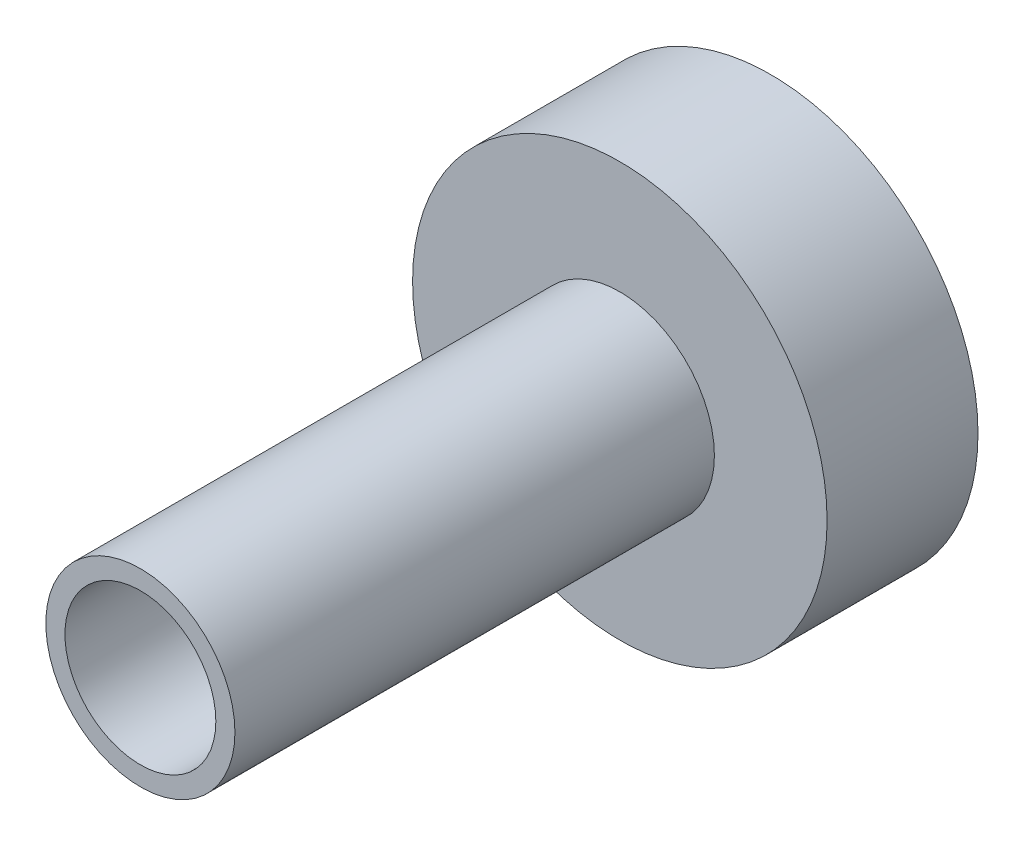
ISO-10303-21;
HEADER;
FILE_DESCRIPTION(('STEP AP214'),'2;1');
FILE_NAME('part.step','',(''),(''),'','','');
FILE_SCHEMA(('AUTOMOTIVE_DESIGN { 1 0 10303 214 1 1 1 1 }'));
ENDSEC;
DATA;
#1=APPLICATION_CONTEXT('core data for automotive mechanical design processes');
#2=APPLICATION_PROTOCOL_DEFINITION('international standard','automotive_design',2000,#1);
#3=PRODUCT_CONTEXT('',#1,'mechanical');
#4=PRODUCT('Part','Part','',(#3));
#5=PRODUCT_RELATED_PRODUCT_CATEGORY('part','',(#4));
#6=PRODUCT_DEFINITION_FORMATION('','',#4);
#7=PRODUCT_DEFINITION_CONTEXT('part definition',#1,'design');
#8=PRODUCT_DEFINITION('design','',#6,#7);
#9=PRODUCT_DEFINITION_SHAPE('','',#8);
#10=(LENGTH_UNIT() NAMED_UNIT(*) SI_UNIT(.MILLI.,.METRE.));
#11=(NAMED_UNIT(*) PLANE_ANGLE_UNIT() SI_UNIT($,.RADIAN.));
#12=(NAMED_UNIT(*) SI_UNIT($,.STERADIAN.) SOLID_ANGLE_UNIT());
#13=UNCERTAINTY_MEASURE_WITH_UNIT(LENGTH_MEASURE(1.E-05),#10,'distance_accuracy_value','');
#14=(GEOMETRIC_REPRESENTATION_CONTEXT(3) GLOBAL_UNCERTAINTY_ASSIGNED_CONTEXT((#13)) GLOBAL_UNIT_ASSIGNED_CONTEXT((#10,
#11,#12)) REPRESENTATION_CONTEXT('',''));
#15=CARTESIAN_POINT('',(0.,0.,0.));
#16=DIRECTION('',(0.,0.,1.));
#17=DIRECTION('',(1.,0.,0.));
#18=AXIS2_PLACEMENT_3D('',#15,#16,#17);
#19=CARTESIAN_POINT('',(0.,0.,33.));
#20=DIRECTION('',(0.,0.,1.));
#21=DIRECTION('',(1.,0.,0.));
#22=AXIS2_PLACEMENT_3D('',#19,#20,#21);
#23=PLANE('',#22);
#24=CARTESIAN_POINT('',(0.,0.,33.));
#25=DIRECTION('',(0.,0.,1.));
#26=DIRECTION('',(1.,0.,0.));
#27=AXIS2_PLACEMENT_3D('',#24,#25,#26);
#28=CIRCLE('',#27,3.95);
#29=CARTESIAN_POINT('',(3.95,0.,33.));
#30=VERTEX_POINT('',#29);
#31=EDGE_CURVE('E38',#30,#30,#28,.T.);
#32=ORIENTED_EDGE('',*,*,#31,.F.);
#33=EDGE_LOOP('',(#32));
#34=FACE_BOUND('',#33,.T.);
#35=CARTESIAN_POINT('',(0.,0.,33.));
#36=DIRECTION('',(0.,0.,1.));
#37=DIRECTION('',(1.,0.,0.));
#38=AXIS2_PLACEMENT_3D('',#35,#36,#37);
#39=CIRCLE('',#38,4.95);
#40=CARTESIAN_POINT('',(4.95,0.,33.));
#41=VERTEX_POINT('',#40);
#42=EDGE_CURVE('E52',#41,#41,#39,.T.);
#43=ORIENTED_EDGE('',*,*,#42,.T.);
#44=EDGE_LOOP('',(#43));
#45=FACE_BOUND('',#44,.T.);
#46=ADVANCED_FACE('F31',(#34,#45),#23,.T.);
#47=CARTESIAN_POINT('',(0.,0.,33.));
#48=DIRECTION('',(0.,0.,-1.));
#49=DIRECTION('',(-1.,0.,0.));
#50=AXIS2_PLACEMENT_3D('',#47,#48,#49);
#51=CYLINDRICAL_SURFACE('',#50,10.85);
#52=CARTESIAN_POINT('',(0.,0.,0.));
#53=DIRECTION('',(0.,0.,1.));
#54=DIRECTION('',(1.,0.,0.));
#55=AXIS2_PLACEMENT_3D('',#52,#53,#54);
#56=CIRCLE('',#55,10.85);
#57=CARTESIAN_POINT('',(10.85,0.,0.));
#58=VERTEX_POINT('',#57);
#59=EDGE_CURVE('E10',#58,#58,#56,.T.);
#60=ORIENTED_EDGE('',*,*,#59,.T.);
#61=EDGE_LOOP('',(#60));
#62=FACE_BOUND('',#61,.T.);
#63=CARTESIAN_POINT('',(0.,0.,7.9));
#64=DIRECTION('',(0.,0.,1.));
#65=DIRECTION('',(1.,0.,0.));
#66=AXIS2_PLACEMENT_3D('',#63,#64,#65);
#67=CIRCLE('',#66,10.85);
#68=CARTESIAN_POINT('',(10.85,0.,7.9));
#69=VERTEX_POINT('',#68);
#70=EDGE_CURVE('E47',#69,#69,#67,.T.);
#71=ORIENTED_EDGE('',*,*,#70,.F.);
#72=EDGE_LOOP('',(#71));
#73=FACE_BOUND('',#72,.T.);
#74=ADVANCED_FACE('F33',(#62,#73),#51,.T.);
#75=CARTESIAN_POINT('',(0.,0.,0.));
#76=DIRECTION('',(0.,0.,1.));
#77=DIRECTION('',(1.,0.,0.));
#78=AXIS2_PLACEMENT_3D('',#75,#76,#77);
#79=PLANE('',#78);
#80=ORIENTED_EDGE('',*,*,#59,.F.);
#81=EDGE_LOOP('',(#80));
#82=FACE_BOUND('',#81,.T.);
#83=CARTESIAN_POINT('',(0.,0.,0.));
#84=DIRECTION('',(0.,0.,1.));
#85=DIRECTION('',(1.,0.,0.));
#86=AXIS2_PLACEMENT_3D('',#83,#84,#85);
#87=CIRCLE('',#86,3.95);
#88=CARTESIAN_POINT('',(3.95,0.,0.));
#89=VERTEX_POINT('',#88);
#90=EDGE_CURVE('E42',#89,#89,#87,.T.);
#91=ORIENTED_EDGE('',*,*,#90,.T.);
#92=EDGE_LOOP('',(#91));
#93=FACE_BOUND('',#92,.T.);
#94=ADVANCED_FACE('F69',(#82,#93),#79,.F.);
#95=CARTESIAN_POINT('',(0.,0.,33.));
#96=DIRECTION('',(0.,0.,-1.));
#97=DIRECTION('',(-1.,0.,0.));
#98=AXIS2_PLACEMENT_3D('',#95,#96,#97);
#99=CYLINDRICAL_SURFACE('',#98,3.95);
#100=ORIENTED_EDGE('',*,*,#31,.T.);
#101=EDGE_LOOP('',(#100));
#102=FACE_BOUND('',#101,.T.);
#103=ORIENTED_EDGE('',*,*,#90,.F.);
#104=EDGE_LOOP('',(#103));
#105=FACE_BOUND('',#104,.T.);
#106=ADVANCED_FACE('F64',(#102,#105),#99,.F.);
#107=CARTESIAN_POINT('',(0.,0.,7.9));
#108=DIRECTION('',(0.,0.,1.));
#109=DIRECTION('',(1.,0.,0.));
#110=AXIS2_PLACEMENT_3D('',#107,#108,#109);
#111=PLANE('',#110);
#112=CARTESIAN_POINT('',(0.,0.,7.9));
#113=DIRECTION('',(0.,0.,1.));
#114=DIRECTION('',(1.,0.,0.));
#115=AXIS2_PLACEMENT_3D('',#112,#113,#114);
#116=CIRCLE('',#115,4.95);
#117=CARTESIAN_POINT('',(4.95,0.,7.9));
#118=VERTEX_POINT('',#117);
#119=EDGE_CURVE('E51',#118,#118,#116,.T.);
#120=ORIENTED_EDGE('',*,*,#119,.F.);
#121=EDGE_LOOP('',(#120));
#122=FACE_BOUND('',#121,.T.);
#123=ORIENTED_EDGE('',*,*,#70,.T.);
#124=EDGE_LOOP('',(#123));
#125=FACE_BOUND('',#124,.T.);
#126=ADVANCED_FACE('F61',(#122,#125),#111,.T.);
#127=CARTESIAN_POINT('',(0.,0.,7.9));
#128=DIRECTION('',(0.,0.,1.));
#129=DIRECTION('',(1.,0.,0.));
#130=AXIS2_PLACEMENT_3D('',#127,#128,#129);
#131=CYLINDRICAL_SURFACE('',#130,4.95);
#132=ORIENTED_EDGE('',*,*,#119,.T.);
#133=EDGE_LOOP('',(#132));
#134=FACE_BOUND('',#133,.T.);
#135=ORIENTED_EDGE('',*,*,#42,.F.);
#136=EDGE_LOOP('',(#135));
#137=FACE_BOUND('',#136,.T.);
#138=ADVANCED_FACE('F58',(#134,#137),#131,.T.);
#139=CLOSED_SHELL('',(#46,#74,#94,#106,#126,#138));
#140=MANIFOLD_SOLID_BREP('B2',#139);
#141=ADVANCED_BREP_SHAPE_REPRESENTATION('',(#18,#140),#14);
#142=SHAPE_DEFINITION_REPRESENTATION(#9,#141);
ENDSEC;
END-ISO-10303-21;
